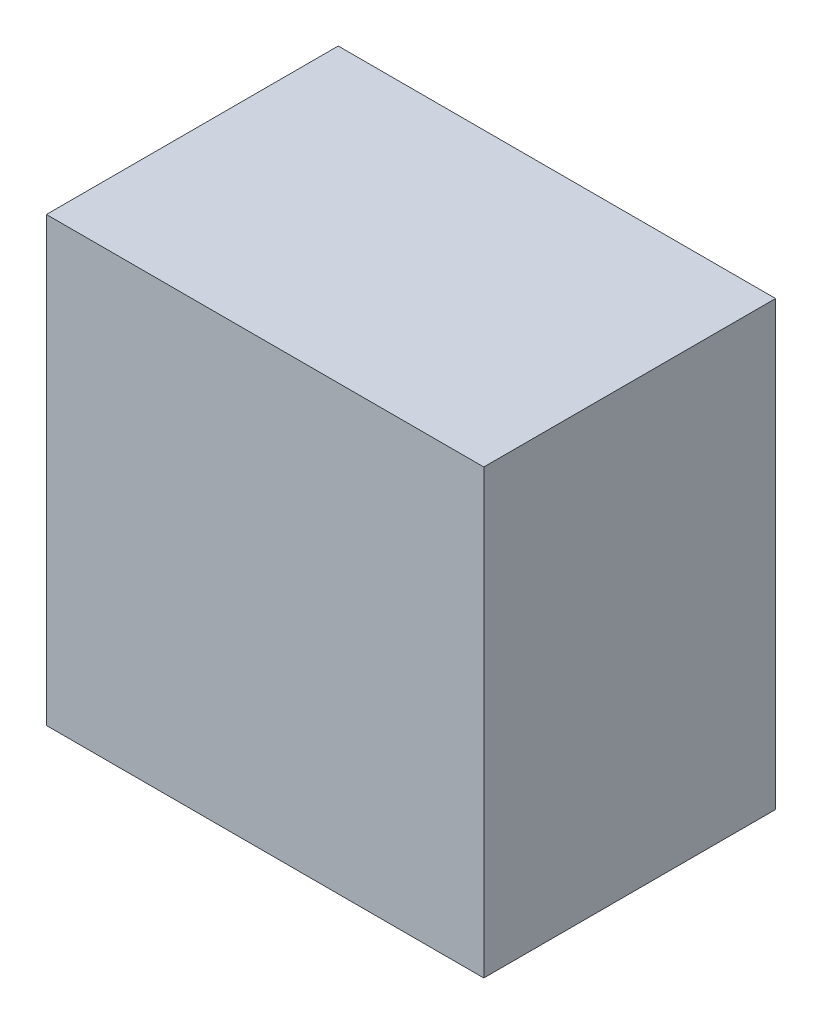
ISO-10303-21;
HEADER;
FILE_DESCRIPTION(('STEP AP214'),'2;1');
FILE_NAME('part.step','',(''),(''),'','','');
FILE_SCHEMA(('AUTOMOTIVE_DESIGN { 1 0 10303 214 1 1 1 1 }'));
ENDSEC;
DATA;
#1=APPLICATION_CONTEXT('core data for automotive mechanical design processes');
#2=APPLICATION_PROTOCOL_DEFINITION('international standard','automotive_design',2000,#1);
#3=PRODUCT_CONTEXT('',#1,'mechanical');
#4=PRODUCT('Part','Part','',(#3));
#5=PRODUCT_RELATED_PRODUCT_CATEGORY('part','',(#4));
#6=PRODUCT_DEFINITION_FORMATION('','',#4);
#7=PRODUCT_DEFINITION_CONTEXT('part definition',#1,'design');
#8=PRODUCT_DEFINITION('design','',#6,#7);
#9=PRODUCT_DEFINITION_SHAPE('','',#8);
#10=(LENGTH_UNIT() NAMED_UNIT(*) SI_UNIT(.MILLI.,.METRE.));
#11=(NAMED_UNIT(*) PLANE_ANGLE_UNIT() SI_UNIT($,.RADIAN.));
#12=(NAMED_UNIT(*) SI_UNIT($,.STERADIAN.) SOLID_ANGLE_UNIT());
#13=UNCERTAINTY_MEASURE_WITH_UNIT(LENGTH_MEASURE(1.E-05),#10,'distance_accuracy_value','');
#14=(GEOMETRIC_REPRESENTATION_CONTEXT(3) GLOBAL_UNCERTAINTY_ASSIGNED_CONTEXT((#13)) GLOBAL_UNIT_ASSIGNED_CONTEXT((#10,
#11,#12)) REPRESENTATION_CONTEXT('',''));
#15=CARTESIAN_POINT('',(0.,0.,0.));
#16=DIRECTION('',(0.,0.,1.));
#17=DIRECTION('',(1.,0.,0.));
#18=AXIS2_PLACEMENT_3D('',#15,#16,#17);
#19=CARTESIAN_POINT('',(-45.5930642340263,23.5799416891496,50.));
#20=DIRECTION('',(1.,0.,0.));
#21=DIRECTION('',(0.,0.,-1.));
#22=AXIS2_PLACEMENT_3D('',#19,#20,#21);
#23=PLANE('',#22);
#24=DIRECTION('',(0.,-1.,0.));
#25=VECTOR('',#24,1.);
#26=CARTESIAN_POINT('',(-45.5930642340263,23.5799416891496,0.));
#27=LINE('',#26,#25);
#28=CARTESIAN_POINT('',(-45.5930642340263,23.5799416891496,0.));
#29=VERTEX_POINT('',#28);
#30=CARTESIAN_POINT('',(-45.5930642340263,-52.2511356003292,0.));
#31=VERTEX_POINT('',#30);
#32=EDGE_CURVE('E115',#29,#31,#27,.T.);
#33=ORIENTED_EDGE('',*,*,#32,.T.);
#34=DIRECTION('',(0.,0.,-1.));
#35=VECTOR('',#34,1.);
#36=CARTESIAN_POINT('',(-45.5930642340263,-52.2511356003292,50.));
#37=LINE('',#36,#35);
#38=CARTESIAN_POINT('',(-45.5930642340263,-52.2511356003292,50.));
#39=VERTEX_POINT('',#38);
#40=EDGE_CURVE('E11',#39,#31,#37,.T.);
#41=ORIENTED_EDGE('',*,*,#40,.F.);
#42=DIRECTION('',(0.,-1.,0.));
#43=VECTOR('',#42,1.);
#44=CARTESIAN_POINT('',(-45.5930642340263,23.5799416891496,50.));
#45=LINE('',#44,#43);
#46=CARTESIAN_POINT('',(-45.5930642340263,23.5799416891496,50.));
#47=VERTEX_POINT('',#46);
#48=EDGE_CURVE('E91',#47,#39,#45,.T.);
#49=ORIENTED_EDGE('',*,*,#48,.F.);
#50=DIRECTION('',(0.,0.,-1.));
#51=VECTOR('',#50,1.);
#52=CARTESIAN_POINT('',(-45.5930642340263,23.5799416891496,50.));
#53=LINE('',#52,#51);
#54=EDGE_CURVE('E107',#47,#29,#53,.T.);
#55=ORIENTED_EDGE('',*,*,#54,.T.);
#56=EDGE_LOOP('',(#33,#41,#49,#55));
#57=FACE_BOUND('',#56,.T.);
#58=ADVANCED_FACE('F41',(#57),#23,.F.);
#59=CARTESIAN_POINT('',(-45.5930642340263,-52.2511356003292,50.));
#60=DIRECTION('',(0.,1.,0.));
#61=DIRECTION('',(0.,0.,1.));
#62=AXIS2_PLACEMENT_3D('',#59,#60,#61);
#63=PLANE('',#62);
#64=DIRECTION('',(1.,0.,0.));
#65=VECTOR('',#64,1.);
#66=CARTESIAN_POINT('',(-45.5930642340263,-52.2511356003292,0.));
#67=LINE('',#66,#65);
#68=CARTESIAN_POINT('',(29.3481085919893,-52.2511356003292,0.));
#69=VERTEX_POINT('',#68);
#70=EDGE_CURVE('E98',#31,#69,#67,.T.);
#71=ORIENTED_EDGE('',*,*,#70,.T.);
#72=DIRECTION('',(0.,0.,-1.));
#73=VECTOR('',#72,1.);
#74=CARTESIAN_POINT('',(29.3481085919893,-52.2511356003292,50.));
#75=LINE('',#74,#73);
#76=CARTESIAN_POINT('',(29.3481085919893,-52.2511356003292,50.));
#77=VERTEX_POINT('',#76);
#78=EDGE_CURVE('E49',#77,#69,#75,.T.);
#79=ORIENTED_EDGE('',*,*,#78,.F.);
#80=DIRECTION('',(1.,0.,0.));
#81=VECTOR('',#80,1.);
#82=CARTESIAN_POINT('',(-45.5930642340263,-52.2511356003292,50.));
#83=LINE('',#82,#81);
#84=EDGE_CURVE('E86',#39,#77,#83,.T.);
#85=ORIENTED_EDGE('',*,*,#84,.F.);
#86=ORIENTED_EDGE('',*,*,#40,.T.);
#87=EDGE_LOOP('',(#71,#79,#85,#86));
#88=FACE_BOUND('',#87,.T.);
#89=ADVANCED_FACE('F100',(#88),#63,.F.);
#90=CARTESIAN_POINT('',(29.3481085919893,23.5799416891496,50.));
#91=DIRECTION('',(-1.,0.,0.));
#92=DIRECTION('',(0.,0.,1.));
#93=AXIS2_PLACEMENT_3D('',#90,#91,#92);
#94=PLANE('',#93);
#95=DIRECTION('',(0.,1.,0.));
#96=VECTOR('',#95,1.);
#97=CARTESIAN_POINT('',(29.3481085919893,23.5799416891496,0.));
#98=LINE('',#97,#96);
#99=CARTESIAN_POINT('',(29.3481085919893,23.5799416891496,0.));
#100=VERTEX_POINT('',#99);
#101=EDGE_CURVE('E73',#69,#100,#98,.T.);
#102=ORIENTED_EDGE('',*,*,#101,.T.);
#103=DIRECTION('',(0.,0.,-1.));
#104=VECTOR('',#103,1.);
#105=CARTESIAN_POINT('',(29.3481085919893,23.5799416891496,50.));
#106=LINE('',#105,#104);
#107=CARTESIAN_POINT('',(29.3481085919893,23.5799416891496,50.));
#108=VERTEX_POINT('',#107);
#109=EDGE_CURVE('E99',#108,#100,#106,.T.);
#110=ORIENTED_EDGE('',*,*,#109,.F.);
#111=DIRECTION('',(0.,1.,0.));
#112=VECTOR('',#111,1.);
#113=CARTESIAN_POINT('',(29.3481085919893,23.5799416891496,50.));
#114=LINE('',#113,#112);
#115=EDGE_CURVE('E93',#77,#108,#114,.T.);
#116=ORIENTED_EDGE('',*,*,#115,.F.);
#117=ORIENTED_EDGE('',*,*,#78,.T.);
#118=EDGE_LOOP('',(#102,#110,#116,#117));
#119=FACE_BOUND('',#118,.T.);
#120=ADVANCED_FACE('F101',(#119),#94,.F.);
#121=CARTESIAN_POINT('',(-45.5930642340263,23.5799416891496,50.));
#122=DIRECTION('',(0.,-1.,0.));
#123=DIRECTION('',(0.,0.,-1.));
#124=AXIS2_PLACEMENT_3D('',#121,#122,#123);
#125=PLANE('',#124);
#126=DIRECTION('',(-1.,0.,0.));
#127=VECTOR('',#126,1.);
#128=CARTESIAN_POINT('',(-45.5930642340263,23.5799416891496,0.));
#129=LINE('',#128,#127);
#130=EDGE_CURVE('E81',#100,#29,#129,.T.);
#131=ORIENTED_EDGE('',*,*,#130,.T.);
#132=ORIENTED_EDGE('',*,*,#54,.F.);
#133=DIRECTION('',(-1.,0.,0.));
#134=VECTOR('',#133,1.);
#135=CARTESIAN_POINT('',(-45.5930642340263,23.5799416891496,50.));
#136=LINE('',#135,#134);
#137=EDGE_CURVE('E59',#108,#47,#136,.T.);
#138=ORIENTED_EDGE('',*,*,#137,.F.);
#139=ORIENTED_EDGE('',*,*,#109,.T.);
#140=EDGE_LOOP('',(#131,#132,#138,#139));
#141=FACE_BOUND('',#140,.T.);
#142=ADVANCED_FACE('F123',(#141),#125,.F.);
#143=CARTESIAN_POINT('',(-45.5930642340263,-52.2511356003292,50.));
#144=DIRECTION('',(0.,0.,1.));
#145=DIRECTION('',(1.,0.,0.));
#146=AXIS2_PLACEMENT_3D('',#143,#144,#145);
#147=PLANE('',#146);
#148=ORIENTED_EDGE('',*,*,#48,.T.);
#149=ORIENTED_EDGE('',*,*,#84,.T.);
#150=ORIENTED_EDGE('',*,*,#115,.T.);
#151=ORIENTED_EDGE('',*,*,#137,.T.);
#152=EDGE_LOOP('',(#148,#149,#150,#151));
#153=FACE_BOUND('',#152,.T.);
#154=ADVANCED_FACE('F90',(#153),#147,.T.);
#155=CARTESIAN_POINT('',(-45.5930642340263,-52.2511356003292,0.));
#156=DIRECTION('',(0.,0.,1.));
#157=DIRECTION('',(1.,0.,0.));
#158=AXIS2_PLACEMENT_3D('',#155,#156,#157);
#159=PLANE('',#158);
#160=ORIENTED_EDGE('',*,*,#32,.F.);
#161=ORIENTED_EDGE('',*,*,#130,.F.);
#162=ORIENTED_EDGE('',*,*,#101,.F.);
#163=ORIENTED_EDGE('',*,*,#70,.F.);
#164=EDGE_LOOP('',(#160,#161,#162,#163));
#165=FACE_BOUND('',#164,.T.);
#166=ADVANCED_FACE('F130',(#165),#159,.F.);
#167=CLOSED_SHELL('',(#58,#89,#120,#142,#154,#166));
#168=MANIFOLD_SOLID_BREP('B2',#167);
#169=ADVANCED_BREP_SHAPE_REPRESENTATION('',(#18,#168),#14);
#170=SHAPE_DEFINITION_REPRESENTATION(#9,#169);
ENDSEC;
END-ISO-10303-21;
